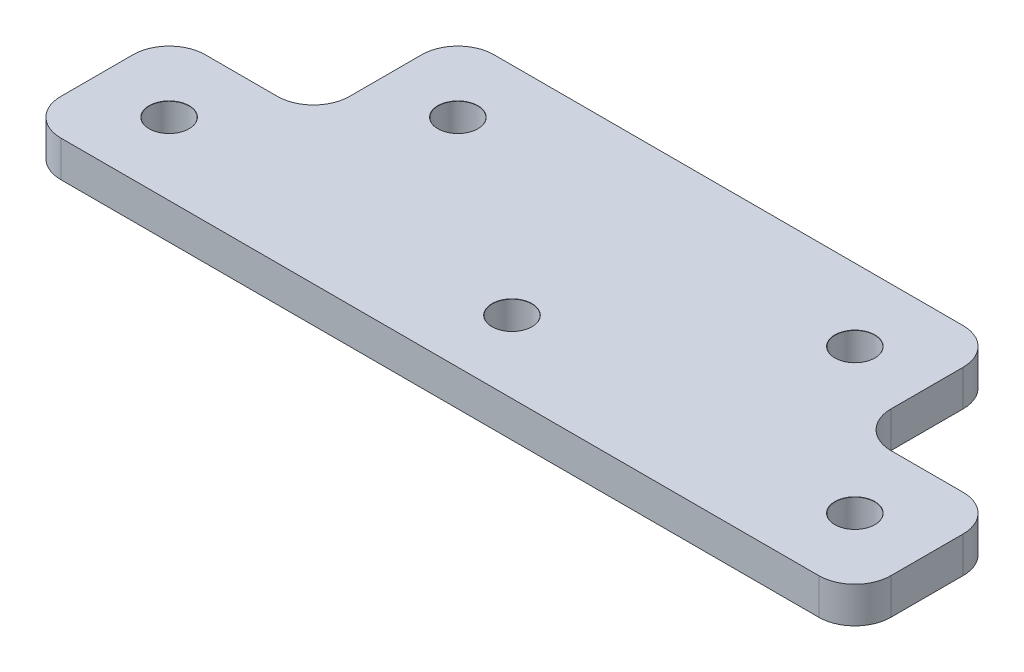
ISO-10303-21;
HEADER;
FILE_DESCRIPTION(('STEP AP214'),'2;1');
FILE_NAME('part.step','',(''),(''),'','','');
FILE_SCHEMA(('AUTOMOTIVE_DESIGN { 1 0 10303 214 1 1 1 1 }'));
ENDSEC;
DATA;
#1=APPLICATION_CONTEXT('core data for automotive mechanical design processes');
#2=APPLICATION_PROTOCOL_DEFINITION('international standard','automotive_design',2000,#1);
#3=PRODUCT_CONTEXT('',#1,'mechanical');
#4=PRODUCT('Part','Part','',(#3));
#5=PRODUCT_RELATED_PRODUCT_CATEGORY('part','',(#4));
#6=PRODUCT_DEFINITION_FORMATION('','',#4);
#7=PRODUCT_DEFINITION_CONTEXT('part definition',#1,'design');
#8=PRODUCT_DEFINITION('design','',#6,#7);
#9=PRODUCT_DEFINITION_SHAPE('','',#8);
#10=(LENGTH_UNIT() NAMED_UNIT(*) SI_UNIT(.MILLI.,.METRE.));
#11=(NAMED_UNIT(*) PLANE_ANGLE_UNIT() SI_UNIT($,.RADIAN.));
#12=(NAMED_UNIT(*) SI_UNIT($,.STERADIAN.) SOLID_ANGLE_UNIT());
#13=UNCERTAINTY_MEASURE_WITH_UNIT(LENGTH_MEASURE(1.E-05),#10,'distance_accuracy_value','');
#14=(GEOMETRIC_REPRESENTATION_CONTEXT(3) GLOBAL_UNCERTAINTY_ASSIGNED_CONTEXT((#13)) GLOBAL_UNIT_ASSIGNED_CONTEXT((#10,
#11,#12)) REPRESENTATION_CONTEXT('',''));
#15=CARTESIAN_POINT('',(0.,0.,0.));
#16=DIRECTION('',(0.,0.,1.));
#17=DIRECTION('',(1.,0.,0.));
#18=AXIS2_PLACEMENT_3D('',#15,#16,#17);
#19=CARTESIAN_POINT('',(37.5,5.,-20.));
#20=DIRECTION('',(-1.,0.,0.));
#21=DIRECTION('',(0.,0.,1.));
#22=AXIS2_PLACEMENT_3D('',#19,#20,#21);
#23=PLANE('',#22);
#24=DIRECTION('',(0.,0.,-1.));
#25=VECTOR('',#24,1.);
#26=CARTESIAN_POINT('',(37.5,5.,-20.));
#27=LINE('',#26,#25);
#28=CARTESIAN_POINT('',(37.5,5.,-25.));
#29=VERTEX_POINT('',#28);
#30=CARTESIAN_POINT('',(37.5,5.,-35.));
#31=VERTEX_POINT('',#30);
#32=EDGE_CURVE('E165',#29,#31,#27,.T.);
#33=ORIENTED_EDGE('',*,*,#32,.F.);
#34=DIRECTION('',(0.,-1.,0.));
#35=VECTOR('',#34,1.);
#36=CARTESIAN_POINT('',(37.5,0.,-25.));
#37=LINE('',#36,#35);
#38=CARTESIAN_POINT('',(37.5,0.,-25.));
#39=VERTEX_POINT('',#38);
#40=EDGE_CURVE('E150',#29,#39,#37,.T.);
#41=ORIENTED_EDGE('',*,*,#40,.T.);
#42=DIRECTION('',(0.,0.,-1.));
#43=VECTOR('',#42,1.);
#44=CARTESIAN_POINT('',(37.5,0.,-20.));
#45=LINE('',#44,#43);
#46=CARTESIAN_POINT('',(37.5,0.,-35.));
#47=VERTEX_POINT('',#46);
#48=EDGE_CURVE('E162',#39,#47,#45,.T.);
#49=ORIENTED_EDGE('',*,*,#48,.T.);
#50=DIRECTION('',(0.,-1.,0.));
#51=VECTOR('',#50,1.);
#52=CARTESIAN_POINT('',(37.5,5.,-35.));
#53=LINE('',#52,#51);
#54=EDGE_CURVE('E167',#47,#31,#53,.F.);
#55=ORIENTED_EDGE('',*,*,#54,.T.);
#56=EDGE_LOOP('',(#33,#41,#49,#55));
#57=FACE_BOUND('',#56,.T.);
#58=ADVANCED_FACE('F32',(#57),#23,.F.);
#59=CARTESIAN_POINT('',(37.5,5.,-40.));
#60=DIRECTION('',(0.,0.,1.));
#61=DIRECTION('',(1.,0.,0.));
#62=AXIS2_PLACEMENT_3D('',#59,#60,#61);
#63=PLANE('',#62);
#64=DIRECTION('',(-1.,0.,0.));
#65=VECTOR('',#64,1.);
#66=CARTESIAN_POINT('',(37.5,0.,-40.));
#67=LINE('',#66,#65);
#68=CARTESIAN_POINT('',(32.5,0.,-40.));
#69=VERTEX_POINT('',#68);
#70=CARTESIAN_POINT('',(-32.5,0.,-40.));
#71=VERTEX_POINT('',#70);
#72=EDGE_CURVE('E173',#69,#71,#67,.T.);
#73=ORIENTED_EDGE('',*,*,#72,.T.);
#74=DIRECTION('',(0.,-1.,0.));
#75=VECTOR('',#74,1.);
#76=CARTESIAN_POINT('',(-32.5,5.,-40.));
#77=LINE('',#76,#75);
#78=CARTESIAN_POINT('',(-32.5,5.,-40.));
#79=VERTEX_POINT('',#78);
#80=EDGE_CURVE('E229',#71,#79,#77,.F.);
#81=ORIENTED_EDGE('',*,*,#80,.T.);
#82=DIRECTION('',(-1.,0.,0.));
#83=VECTOR('',#82,1.);
#84=CARTESIAN_POINT('',(37.5,5.,-40.));
#85=LINE('',#84,#83);
#86=CARTESIAN_POINT('',(32.5,5.,-40.));
#87=VERTEX_POINT('',#86);
#88=EDGE_CURVE('E281',#87,#79,#85,.T.);
#89=ORIENTED_EDGE('',*,*,#88,.F.);
#90=DIRECTION('',(0.,-1.,0.));
#91=VECTOR('',#90,1.);
#92=CARTESIAN_POINT('',(32.5,5.,-40.));
#93=LINE('',#92,#91);
#94=EDGE_CURVE('E226',#87,#69,#93,.T.);
#95=ORIENTED_EDGE('',*,*,#94,.T.);
#96=EDGE_LOOP('',(#73,#81,#89,#95));
#97=FACE_BOUND('',#96,.T.);
#98=ADVANCED_FACE('F323',(#97),#63,.F.);
#99=CARTESIAN_POINT('',(-37.5,5.,-40.));
#100=DIRECTION('',(1.,0.,0.));
#101=DIRECTION('',(0.,0.,-1.));
#102=AXIS2_PLACEMENT_3D('',#99,#100,#101);
#103=PLANE('',#102);
#104=DIRECTION('',(0.,0.,1.));
#105=VECTOR('',#104,1.);
#106=CARTESIAN_POINT('',(-37.5,0.,-40.));
#107=LINE('',#106,#105);
#108=CARTESIAN_POINT('',(-37.5,0.,-35.));
#109=VERTEX_POINT('',#108);
#110=CARTESIAN_POINT('',(-37.5,0.,-25.));
#111=VERTEX_POINT('',#110);
#112=EDGE_CURVE('E177',#109,#111,#107,.T.);
#113=ORIENTED_EDGE('',*,*,#112,.T.);
#114=DIRECTION('',(0.,-1.,0.));
#115=VECTOR('',#114,1.);
#116=CARTESIAN_POINT('',(-37.5,5.,-25.));
#117=LINE('',#116,#115);
#118=CARTESIAN_POINT('',(-37.5,5.,-25.));
#119=VERTEX_POINT('',#118);
#120=EDGE_CURVE('E213',#111,#119,#117,.F.);
#121=ORIENTED_EDGE('',*,*,#120,.T.);
#122=DIRECTION('',(0.,0.,1.));
#123=VECTOR('',#122,1.);
#124=CARTESIAN_POINT('',(-37.5,5.,-40.));
#125=LINE('',#124,#123);
#126=CARTESIAN_POINT('',(-37.5,5.,-35.));
#127=VERTEX_POINT('',#126);
#128=EDGE_CURVE('E272',#127,#119,#125,.T.);
#129=ORIENTED_EDGE('',*,*,#128,.F.);
#130=DIRECTION('',(0.,-1.,0.));
#131=VECTOR('',#130,1.);
#132=CARTESIAN_POINT('',(-37.5,5.,-35.));
#133=LINE('',#132,#131);
#134=EDGE_CURVE('E210',#127,#109,#133,.T.);
#135=ORIENTED_EDGE('',*,*,#134,.T.);
#136=EDGE_LOOP('',(#113,#121,#129,#135));
#137=FACE_BOUND('',#136,.T.);
#138=ADVANCED_FACE('F260',(#137),#103,.F.);
#139=CARTESIAN_POINT('',(-37.5,5.,-20.));
#140=DIRECTION('',(0.,0.,1.));
#141=DIRECTION('',(1.,0.,0.));
#142=AXIS2_PLACEMENT_3D('',#139,#140,#141);
#143=PLANE('',#142);
#144=DIRECTION('',(-1.,0.,0.));
#145=VECTOR('',#144,1.);
#146=CARTESIAN_POINT('',(-37.5,5.,-20.));
#147=LINE('',#146,#145);
#148=CARTESIAN_POINT('',(-42.5,5.,-20.));
#149=VERTEX_POINT('',#148);
#150=CARTESIAN_POINT('',(-52.5,5.,-20.));
#151=VERTEX_POINT('',#150);
#152=EDGE_CURVE('E270',#149,#151,#147,.T.);
#153=ORIENTED_EDGE('',*,*,#152,.F.);
#154=DIRECTION('',(0.,-1.,0.));
#155=VECTOR('',#154,1.);
#156=CARTESIAN_POINT('',(-42.5,0.,-20.));
#157=LINE('',#156,#155);
#158=CARTESIAN_POINT('',(-42.5,0.,-20.));
#159=VERTEX_POINT('',#158);
#160=EDGE_CURVE('E207',#149,#159,#157,.T.);
#161=ORIENTED_EDGE('',*,*,#160,.T.);
#162=DIRECTION('',(-1.,0.,0.));
#163=VECTOR('',#162,1.);
#164=CARTESIAN_POINT('',(-37.5,0.,-20.));
#165=LINE('',#164,#163);
#166=CARTESIAN_POINT('',(-52.5,0.,-20.));
#167=VERTEX_POINT('',#166);
#168=EDGE_CURVE('E188',#159,#167,#165,.T.);
#169=ORIENTED_EDGE('',*,*,#168,.T.);
#170=DIRECTION('',(0.,-1.,0.));
#171=VECTOR('',#170,1.);
#172=CARTESIAN_POINT('',(-52.5,5.,-20.));
#173=LINE('',#172,#171);
#174=EDGE_CURVE('E205',#167,#151,#173,.F.);
#175=ORIENTED_EDGE('',*,*,#174,.T.);
#176=EDGE_LOOP('',(#153,#161,#169,#175));
#177=FACE_BOUND('',#176,.T.);
#178=ADVANCED_FACE('F274',(#177),#143,.F.);
#179=CARTESIAN_POINT('',(-57.5,5.,-20.));
#180=DIRECTION('',(1.,0.,0.));
#181=DIRECTION('',(0.,0.,-1.));
#182=AXIS2_PLACEMENT_3D('',#179,#180,#181);
#183=PLANE('',#182);
#184=DIRECTION('',(0.,0.,1.));
#185=VECTOR('',#184,1.);
#186=CARTESIAN_POINT('',(-57.5,5.,-20.));
#187=LINE('',#186,#185);
#188=CARTESIAN_POINT('',(-57.5,5.,-15.));
#189=VERTEX_POINT('',#188);
#190=CARTESIAN_POINT('',(-57.5,5.,-5.00000000000001));
#191=VERTEX_POINT('',#190);
#192=EDGE_CURVE('E276',#189,#191,#187,.T.);
#193=ORIENTED_EDGE('',*,*,#192,.F.);
#194=DIRECTION('',(0.,-1.,0.));
#195=VECTOR('',#194,1.);
#196=CARTESIAN_POINT('',(-57.5,5.,-15.));
#197=LINE('',#196,#195);
#198=CARTESIAN_POINT('',(-57.5,0.,-15.));
#199=VERTEX_POINT('',#198);
#200=EDGE_CURVE('E157',#189,#199,#197,.T.);
#201=ORIENTED_EDGE('',*,*,#200,.T.);
#202=DIRECTION('',(0.,0.,1.));
#203=VECTOR('',#202,1.);
#204=CARTESIAN_POINT('',(-57.5,0.,-20.));
#205=LINE('',#204,#203);
#206=CARTESIAN_POINT('',(-57.5,0.,-5.00000000000001));
#207=VERTEX_POINT('',#206);
#208=EDGE_CURVE('E191',#199,#207,#205,.T.);
#209=ORIENTED_EDGE('',*,*,#208,.T.);
#210=DIRECTION('',(0.,-1.,0.));
#211=VECTOR('',#210,1.);
#212=CARTESIAN_POINT('',(-57.5,5.,-5.00000000000001));
#213=LINE('',#212,#211);
#214=EDGE_CURVE('E251',#207,#191,#213,.F.);
#215=ORIENTED_EDGE('',*,*,#214,.T.);
#216=EDGE_LOOP('',(#193,#201,#209,#215));
#217=FACE_BOUND('',#216,.T.);
#218=ADVANCED_FACE('F311',(#217),#183,.F.);
#219=CARTESIAN_POINT('',(-57.5,5.,0.));
#220=DIRECTION('',(0.,0.,-1.));
#221=DIRECTION('',(-1.,0.,0.));
#222=AXIS2_PLACEMENT_3D('',#219,#220,#221);
#223=PLANE('',#222);
#224=DIRECTION('',(1.,0.,0.));
#225=VECTOR('',#224,1.);
#226=CARTESIAN_POINT('',(-57.5,0.,0.));
#227=LINE('',#226,#225);
#228=CARTESIAN_POINT('',(-52.5,0.,0.));
#229=VERTEX_POINT('',#228);
#230=CARTESIAN_POINT('',(52.5,0.,0.));
#231=VERTEX_POINT('',#230);
#232=EDGE_CURVE('E194',#229,#231,#227,.T.);
#233=ORIENTED_EDGE('',*,*,#232,.T.);
#234=DIRECTION('',(0.,-1.,0.));
#235=VECTOR('',#234,1.);
#236=CARTESIAN_POINT('',(52.5,5.,0.));
#237=LINE('',#236,#235);
#238=CARTESIAN_POINT('',(52.5,5.,0.));
#239=VERTEX_POINT('',#238);
#240=EDGE_CURVE('E249',#231,#239,#237,.F.);
#241=ORIENTED_EDGE('',*,*,#240,.T.);
#242=DIRECTION('',(1.,0.,0.));
#243=VECTOR('',#242,1.);
#244=CARTESIAN_POINT('',(-57.5,5.,0.));
#245=LINE('',#244,#243);
#246=CARTESIAN_POINT('',(-52.5,5.,0.));
#247=VERTEX_POINT('',#246);
#248=EDGE_CURVE('E279',#247,#239,#245,.T.);
#249=ORIENTED_EDGE('',*,*,#248,.F.);
#250=DIRECTION('',(0.,-1.,0.));
#251=VECTOR('',#250,1.);
#252=CARTESIAN_POINT('',(-52.5,5.,0.));
#253=LINE('',#252,#251);
#254=EDGE_CURVE('E246',#247,#229,#253,.T.);
#255=ORIENTED_EDGE('',*,*,#254,.T.);
#256=EDGE_LOOP('',(#233,#241,#249,#255));
#257=FACE_BOUND('',#256,.T.);
#258=ADVANCED_FACE('F302',(#257),#223,.F.);
#259=CARTESIAN_POINT('',(57.5,5.,0.));
#260=DIRECTION('',(-1.,0.,0.));
#261=DIRECTION('',(0.,0.,1.));
#262=AXIS2_PLACEMENT_3D('',#259,#260,#261);
#263=PLANE('',#262);
#264=DIRECTION('',(0.,0.,-1.));
#265=VECTOR('',#264,1.);
#266=CARTESIAN_POINT('',(57.5,5.,0.));
#267=LINE('',#266,#265);
#268=CARTESIAN_POINT('',(57.5,5.,-5.));
#269=VERTEX_POINT('',#268);
#270=CARTESIAN_POINT('',(57.5,5.,-15.));
#271=VERTEX_POINT('',#270);
#272=EDGE_CURVE('E285',#269,#271,#267,.T.);
#273=ORIENTED_EDGE('',*,*,#272,.F.);
#274=DIRECTION('',(0.,-1.,0.));
#275=VECTOR('',#274,1.);
#276=CARTESIAN_POINT('',(57.5,5.,-5.));
#277=LINE('',#276,#275);
#278=CARTESIAN_POINT('',(57.5,0.,-5.));
#279=VERTEX_POINT('',#278);
#280=EDGE_CURVE('E243',#269,#279,#277,.T.);
#281=ORIENTED_EDGE('',*,*,#280,.T.);
#282=DIRECTION('',(0.,0.,-1.));
#283=VECTOR('',#282,1.);
#284=CARTESIAN_POINT('',(57.5,0.,0.));
#285=LINE('',#284,#283);
#286=CARTESIAN_POINT('',(57.5,0.,-15.));
#287=VERTEX_POINT('',#286);
#288=EDGE_CURVE('E197',#279,#287,#285,.T.);
#289=ORIENTED_EDGE('',*,*,#288,.T.);
#290=DIRECTION('',(0.,-1.,0.));
#291=VECTOR('',#290,1.);
#292=CARTESIAN_POINT('',(57.5,5.,-15.));
#293=LINE('',#292,#291);
#294=EDGE_CURVE('E47',#287,#271,#293,.F.);
#295=ORIENTED_EDGE('',*,*,#294,.T.);
#296=EDGE_LOOP('',(#273,#281,#289,#295));
#297=FACE_BOUND('',#296,.T.);
#298=ADVANCED_FACE('F295',(#297),#263,.F.);
#299=CARTESIAN_POINT('',(57.5,5.,-20.));
#300=DIRECTION('',(0.,0.,1.));
#301=DIRECTION('',(1.,0.,0.));
#302=AXIS2_PLACEMENT_3D('',#299,#300,#301);
#303=PLANE('',#302);
#304=DIRECTION('',(-1.,0.,0.));
#305=VECTOR('',#304,1.);
#306=CARTESIAN_POINT('',(57.5,0.,-20.));
#307=LINE('',#306,#305);
#308=CARTESIAN_POINT('',(52.5,0.,-20.));
#309=VERTEX_POINT('',#308);
#310=CARTESIAN_POINT('',(42.5,0.,-20.));
#311=VERTEX_POINT('',#310);
#312=EDGE_CURVE('E199',#309,#311,#307,.T.);
#313=ORIENTED_EDGE('',*,*,#312,.T.);
#314=DIRECTION('',(0.,-1.,0.));
#315=VECTOR('',#314,1.);
#316=CARTESIAN_POINT('',(42.5,5.,-20.));
#317=LINE('',#316,#315);
#318=CARTESIAN_POINT('',(42.5,5.,-20.));
#319=VERTEX_POINT('',#318);
#320=EDGE_CURVE('E151',#311,#319,#317,.F.);
#321=ORIENTED_EDGE('',*,*,#320,.T.);
#322=DIRECTION('',(-1.,0.,0.));
#323=VECTOR('',#322,1.);
#324=CARTESIAN_POINT('',(57.5,5.,-20.));
#325=LINE('',#324,#323);
#326=CARTESIAN_POINT('',(52.5,5.,-20.));
#327=VERTEX_POINT('',#326);
#328=EDGE_CURVE('E183',#327,#319,#325,.T.);
#329=ORIENTED_EDGE('',*,*,#328,.F.);
#330=DIRECTION('',(0.,-1.,0.));
#331=VECTOR('',#330,1.);
#332=CARTESIAN_POINT('',(52.5,5.,-20.));
#333=LINE('',#332,#331);
#334=EDGE_CURVE('E166',#327,#309,#333,.T.);
#335=ORIENTED_EDGE('',*,*,#334,.T.);
#336=EDGE_LOOP('',(#313,#321,#329,#335));
#337=FACE_BOUND('',#336,.T.);
#338=ADVANCED_FACE('F291',(#337),#303,.F.);
#339=CARTESIAN_POINT('',(0.,5.,0.));
#340=DIRECTION('',(0.,1.,0.));
#341=DIRECTION('',(0.,0.,1.));
#342=AXIS2_PLACEMENT_3D('',#339,#340,#341);
#343=PLANE('',#342);
#344=CARTESIAN_POINT('',(0.,5.,-10.));
#345=DIRECTION('',(0.,1.,0.));
#346=DIRECTION('',(0.,0.,1.));
#347=AXIS2_PLACEMENT_3D('',#344,#345,#346);
#348=CIRCLE('',#347,2.775);
#349=CARTESIAN_POINT('',(0.,5.,-7.225));
#350=VERTEX_POINT('',#349);
#351=EDGE_CURVE('E571',#350,#350,#348,.T.);
#352=ORIENTED_EDGE('',*,*,#351,.F.);
#353=EDGE_LOOP('',(#352));
#354=FACE_BOUND('',#353,.T.);
#355=CARTESIAN_POINT('',(47.5,5.,-10.));
#356=DIRECTION('',(0.,1.,0.));
#357=DIRECTION('',(0.,0.,1.));
#358=AXIS2_PLACEMENT_3D('',#355,#356,#357);
#359=CIRCLE('',#358,2.775);
#360=CARTESIAN_POINT('',(47.5,5.,-7.225));
#361=VERTEX_POINT('',#360);
#362=EDGE_CURVE('E578',#361,#361,#359,.T.);
#363=ORIENTED_EDGE('',*,*,#362,.F.);
#364=EDGE_LOOP('',(#363));
#365=FACE_BOUND('',#364,.T.);
#366=CARTESIAN_POINT('',(-47.5,5.,-10.));
#367=DIRECTION('',(0.,1.,0.));
#368=DIRECTION('',(0.,0.,1.));
#369=AXIS2_PLACEMENT_3D('',#366,#367,#368);
#370=CIRCLE('',#369,2.775);
#371=CARTESIAN_POINT('',(-47.5,5.,-7.225));
#372=VERTEX_POINT('',#371);
#373=EDGE_CURVE('E587',#372,#372,#370,.T.);
#374=ORIENTED_EDGE('',*,*,#373,.F.);
#375=EDGE_LOOP('',(#374));
#376=FACE_BOUND('',#375,.T.);
#377=CARTESIAN_POINT('',(27.5,5.,-30.));
#378=DIRECTION('',(0.,1.,0.));
#379=DIRECTION('',(0.,0.,1.));
#380=AXIS2_PLACEMENT_3D('',#377,#378,#379);
#381=CIRCLE('',#380,2.775);
#382=CARTESIAN_POINT('',(27.5,5.,-27.225));
#383=VERTEX_POINT('',#382);
#384=EDGE_CURVE('E596',#383,#383,#381,.T.);
#385=ORIENTED_EDGE('',*,*,#384,.F.);
#386=EDGE_LOOP('',(#385));
#387=FACE_BOUND('',#386,.T.);
#388=CARTESIAN_POINT('',(-27.5,5.,-30.));
#389=DIRECTION('',(0.,1.,0.));
#390=DIRECTION('',(0.,0.,1.));
#391=AXIS2_PLACEMENT_3D('',#388,#389,#390);
#392=CIRCLE('',#391,2.775);
#393=CARTESIAN_POINT('',(-27.5,5.,-27.225));
#394=VERTEX_POINT('',#393);
#395=EDGE_CURVE('E605',#394,#394,#392,.T.);
#396=ORIENTED_EDGE('',*,*,#395,.F.);
#397=EDGE_LOOP('',(#396));
#398=FACE_BOUND('',#397,.T.);
#399=ORIENTED_EDGE('',*,*,#88,.T.);
#400=CARTESIAN_POINT('',(-32.5,5.,-35.));
#401=DIRECTION('',(0.,1.,0.));
#402=DIRECTION('',(0.,0.,1.));
#403=AXIS2_PLACEMENT_3D('',#400,#401,#402);
#404=CIRCLE('',#403,5.);
#405=EDGE_CURVE('E240',#79,#127,#404,.T.);
#406=ORIENTED_EDGE('',*,*,#405,.T.);
#407=ORIENTED_EDGE('',*,*,#128,.T.);
#408=CARTESIAN_POINT('',(-42.5,5.,-25.));
#409=DIRECTION('',(0.,1.,0.));
#410=DIRECTION('',(0.,0.,1.));
#411=AXIS2_PLACEMENT_3D('',#408,#409,#410);
#412=CIRCLE('',#411,5.);
#413=EDGE_CURVE('E11',#119,#149,#412,.F.);
#414=ORIENTED_EDGE('',*,*,#413,.T.);
#415=ORIENTED_EDGE('',*,*,#152,.T.);
#416=CARTESIAN_POINT('',(-52.5,5.,-15.));
#417=DIRECTION('',(0.,1.,0.));
#418=DIRECTION('',(0.,0.,1.));
#419=AXIS2_PLACEMENT_3D('',#416,#417,#418);
#420=CIRCLE('',#419,5.);
#421=EDGE_CURVE('E233',#151,#189,#420,.T.);
#422=ORIENTED_EDGE('',*,*,#421,.T.);
#423=ORIENTED_EDGE('',*,*,#192,.T.);
#424=CARTESIAN_POINT('',(-52.5,5.,-5.));
#425=DIRECTION('',(0.,1.,0.));
#426=DIRECTION('',(0.,0.,1.));
#427=AXIS2_PLACEMENT_3D('',#424,#425,#426);
#428=CIRCLE('',#427,5.);
#429=EDGE_CURVE('E231',#191,#247,#428,.T.);
#430=ORIENTED_EDGE('',*,*,#429,.T.);
#431=ORIENTED_EDGE('',*,*,#248,.T.);
#432=CARTESIAN_POINT('',(52.5,5.,-5.));
#433=DIRECTION('',(0.,1.,0.));
#434=DIRECTION('',(0.,0.,1.));
#435=AXIS2_PLACEMENT_3D('',#432,#433,#434);
#436=CIRCLE('',#435,5.);
#437=EDGE_CURVE('E54',#239,#269,#436,.T.);
#438=ORIENTED_EDGE('',*,*,#437,.T.);
#439=ORIENTED_EDGE('',*,*,#272,.T.);
#440=CARTESIAN_POINT('',(52.5,5.,-15.));
#441=DIRECTION('',(0.,1.,0.));
#442=DIRECTION('',(0.,0.,1.));
#443=AXIS2_PLACEMENT_3D('',#440,#441,#442);
#444=CIRCLE('',#443,5.);
#445=EDGE_CURVE('E235',#271,#327,#444,.T.);
#446=ORIENTED_EDGE('',*,*,#445,.T.);
#447=ORIENTED_EDGE('',*,*,#328,.T.);
#448=CARTESIAN_POINT('',(42.5,5.,-25.));
#449=DIRECTION('',(0.,1.,0.));
#450=DIRECTION('',(0.,0.,1.));
#451=AXIS2_PLACEMENT_3D('',#448,#449,#450);
#452=CIRCLE('',#451,5.);
#453=EDGE_CURVE('E156',#319,#29,#452,.F.);
#454=ORIENTED_EDGE('',*,*,#453,.T.);
#455=ORIENTED_EDGE('',*,*,#32,.T.);
#456=CARTESIAN_POINT('',(32.5,5.,-35.));
#457=DIRECTION('',(0.,1.,0.));
#458=DIRECTION('',(0.,0.,1.));
#459=AXIS2_PLACEMENT_3D('',#456,#457,#458);
#460=CIRCLE('',#459,5.);
#461=EDGE_CURVE('E238',#31,#87,#460,.T.);
#462=ORIENTED_EDGE('',*,*,#461,.T.);
#463=EDGE_LOOP('',(#399,#406,#407,#414,#415,#422,#423,#430,#431,#438,#439,#446,#447,#454,#455,#462));
#464=FACE_BOUND('',#463,.T.);
#465=ADVANCED_FACE('F269',(#354,#365,#376,#387,#398,#464),#343,.T.);
#466=CARTESIAN_POINT('',(0.,0.,0.));
#467=DIRECTION('',(0.,1.,0.));
#468=DIRECTION('',(0.,0.,1.));
#469=AXIS2_PLACEMENT_3D('',#466,#467,#468);
#470=PLANE('',#469);
#471=CARTESIAN_POINT('',(0.,0.,-10.));
#472=DIRECTION('',(0.,1.,0.));
#473=DIRECTION('',(0.,0.,1.));
#474=AXIS2_PLACEMENT_3D('',#471,#472,#473);
#475=CIRCLE('',#474,2.75);
#476=CARTESIAN_POINT('',(0.,0.,-7.25));
#477=VERTEX_POINT('',#476);
#478=EDGE_CURVE('E573',#477,#477,#475,.T.);
#479=ORIENTED_EDGE('',*,*,#478,.T.);
#480=EDGE_LOOP('',(#479));
#481=FACE_BOUND('',#480,.T.);
#482=CARTESIAN_POINT('',(47.5,0.,-10.));
#483=DIRECTION('',(0.,1.,0.));
#484=DIRECTION('',(0.,0.,1.));
#485=AXIS2_PLACEMENT_3D('',#482,#483,#484);
#486=CIRCLE('',#485,2.75);
#487=CARTESIAN_POINT('',(47.5,0.,-7.25));
#488=VERTEX_POINT('',#487);
#489=EDGE_CURVE('E584',#488,#488,#486,.T.);
#490=ORIENTED_EDGE('',*,*,#489,.T.);
#491=EDGE_LOOP('',(#490));
#492=FACE_BOUND('',#491,.T.);
#493=CARTESIAN_POINT('',(-47.5,0.,-10.));
#494=DIRECTION('',(0.,1.,0.));
#495=DIRECTION('',(0.,0.,1.));
#496=AXIS2_PLACEMENT_3D('',#493,#494,#495);
#497=CIRCLE('',#496,2.75);
#498=CARTESIAN_POINT('',(-47.5,0.,-7.25));
#499=VERTEX_POINT('',#498);
#500=EDGE_CURVE('E593',#499,#499,#497,.T.);
#501=ORIENTED_EDGE('',*,*,#500,.T.);
#502=EDGE_LOOP('',(#501));
#503=FACE_BOUND('',#502,.T.);
#504=CARTESIAN_POINT('',(27.5,0.,-30.));
#505=DIRECTION('',(0.,1.,0.));
#506=DIRECTION('',(0.,0.,1.));
#507=AXIS2_PLACEMENT_3D('',#504,#505,#506);
#508=CIRCLE('',#507,2.75);
#509=CARTESIAN_POINT('',(27.5,0.,-27.25));
#510=VERTEX_POINT('',#509);
#511=EDGE_CURVE('E602',#510,#510,#508,.T.);
#512=ORIENTED_EDGE('',*,*,#511,.T.);
#513=EDGE_LOOP('',(#512));
#514=FACE_BOUND('',#513,.T.);
#515=CARTESIAN_POINT('',(-27.5,0.,-30.));
#516=DIRECTION('',(0.,1.,0.));
#517=DIRECTION('',(0.,0.,1.));
#518=AXIS2_PLACEMENT_3D('',#515,#516,#517);
#519=CIRCLE('',#518,2.75);
#520=CARTESIAN_POINT('',(-27.5,0.,-27.25));
#521=VERTEX_POINT('',#520);
#522=EDGE_CURVE('E174',#521,#521,#519,.T.);
#523=ORIENTED_EDGE('',*,*,#522,.T.);
#524=EDGE_LOOP('',(#523));
#525=FACE_BOUND('',#524,.T.);
#526=ORIENTED_EDGE('',*,*,#112,.F.);
#527=CARTESIAN_POINT('',(-32.5,0.,-35.));
#528=DIRECTION('',(0.,1.,0.));
#529=DIRECTION('',(0.,0.,1.));
#530=AXIS2_PLACEMENT_3D('',#527,#528,#529);
#531=CIRCLE('',#530,5.);
#532=EDGE_CURVE('E224',#109,#71,#531,.F.);
#533=ORIENTED_EDGE('',*,*,#532,.T.);
#534=ORIENTED_EDGE('',*,*,#72,.F.);
#535=CARTESIAN_POINT('',(32.5,0.,-35.));
#536=DIRECTION('',(0.,1.,0.));
#537=DIRECTION('',(0.,0.,1.));
#538=AXIS2_PLACEMENT_3D('',#535,#536,#537);
#539=CIRCLE('',#538,5.);
#540=EDGE_CURVE('E172',#69,#47,#539,.F.);
#541=ORIENTED_EDGE('',*,*,#540,.T.);
#542=ORIENTED_EDGE('',*,*,#48,.F.);
#543=CARTESIAN_POINT('',(42.5,0.,-25.));
#544=DIRECTION('',(0.,1.,0.));
#545=DIRECTION('',(0.,0.,1.));
#546=AXIS2_PLACEMENT_3D('',#543,#544,#545);
#547=CIRCLE('',#546,5.);
#548=EDGE_CURVE('E146',#39,#311,#547,.T.);
#549=ORIENTED_EDGE('',*,*,#548,.T.);
#550=ORIENTED_EDGE('',*,*,#312,.F.);
#551=CARTESIAN_POINT('',(52.5,0.,-15.));
#552=DIRECTION('',(0.,1.,0.));
#553=DIRECTION('',(0.,0.,1.));
#554=AXIS2_PLACEMENT_3D('',#551,#552,#553);
#555=CIRCLE('',#554,5.);
#556=EDGE_CURVE('E219',#309,#287,#555,.F.);
#557=ORIENTED_EDGE('',*,*,#556,.T.);
#558=ORIENTED_EDGE('',*,*,#288,.F.);
#559=CARTESIAN_POINT('',(52.5,0.,-5.));
#560=DIRECTION('',(0.,1.,0.));
#561=DIRECTION('',(0.,0.,1.));
#562=AXIS2_PLACEMENT_3D('',#559,#560,#561);
#563=CIRCLE('',#562,5.);
#564=EDGE_CURVE('E221',#279,#231,#563,.F.);
#565=ORIENTED_EDGE('',*,*,#564,.T.);
#566=ORIENTED_EDGE('',*,*,#232,.F.);
#567=CARTESIAN_POINT('',(-52.5,0.,-5.));
#568=DIRECTION('',(0.,1.,0.));
#569=DIRECTION('',(0.,0.,1.));
#570=AXIS2_PLACEMENT_3D('',#567,#568,#569);
#571=CIRCLE('',#570,5.);
#572=EDGE_CURVE('E215',#229,#207,#571,.F.);
#573=ORIENTED_EDGE('',*,*,#572,.T.);
#574=ORIENTED_EDGE('',*,*,#208,.F.);
#575=CARTESIAN_POINT('',(-52.5,0.,-15.));
#576=DIRECTION('',(0.,1.,0.));
#577=DIRECTION('',(0.,0.,1.));
#578=AXIS2_PLACEMENT_3D('',#575,#576,#577);
#579=CIRCLE('',#578,5.);
#580=EDGE_CURVE('E217',#199,#167,#579,.F.);
#581=ORIENTED_EDGE('',*,*,#580,.T.);
#582=ORIENTED_EDGE('',*,*,#168,.F.);
#583=CARTESIAN_POINT('',(-42.5,0.,-25.));
#584=DIRECTION('',(0.,1.,0.));
#585=DIRECTION('',(0.,0.,1.));
#586=AXIS2_PLACEMENT_3D('',#583,#584,#585);
#587=CIRCLE('',#586,5.);
#588=EDGE_CURVE('E40',#159,#111,#587,.T.);
#589=ORIENTED_EDGE('',*,*,#588,.T.);
#590=EDGE_LOOP('',(#526,#533,#534,#541,#542,#549,#550,#557,#558,#565,#566,#573,#574,#581,#582,#589));
#591=FACE_BOUND('',#590,.T.);
#592=ADVANCED_FACE('F170',(#481,#492,#503,#514,#525,#591),#470,.F.);
#593=CARTESIAN_POINT('',(42.5,5.,-25.));
#594=DIRECTION('',(0.,1.,0.));
#595=DIRECTION('',(0.,0.,1.));
#596=AXIS2_PLACEMENT_3D('',#593,#594,#595);
#597=CYLINDRICAL_SURFACE('',#596,5.);
#598=ORIENTED_EDGE('',*,*,#453,.F.);
#599=ORIENTED_EDGE('',*,*,#320,.F.);
#600=ORIENTED_EDGE('',*,*,#548,.F.);
#601=ORIENTED_EDGE('',*,*,#40,.F.);
#602=EDGE_LOOP('',(#598,#599,#600,#601));
#603=FACE_BOUND('',#602,.T.);
#604=ADVANCED_FACE('F149',(#603),#597,.F.);
#605=CARTESIAN_POINT('',(-42.5,5.,-25.));
#606=DIRECTION('',(0.,1.,0.));
#607=DIRECTION('',(0.,0.,1.));
#608=AXIS2_PLACEMENT_3D('',#605,#606,#607);
#609=CYLINDRICAL_SURFACE('',#608,5.);
#610=ORIENTED_EDGE('',*,*,#413,.F.);
#611=ORIENTED_EDGE('',*,*,#120,.F.);
#612=ORIENTED_EDGE('',*,*,#588,.F.);
#613=ORIENTED_EDGE('',*,*,#160,.F.);
#614=EDGE_LOOP('',(#610,#611,#612,#613));
#615=FACE_BOUND('',#614,.T.);
#616=ADVANCED_FACE('F265',(#615),#609,.F.);
#617=CARTESIAN_POINT('',(-32.5,5.,-35.));
#618=DIRECTION('',(0.,-1.,0.));
#619=DIRECTION('',(0.,0.,-1.));
#620=AXIS2_PLACEMENT_3D('',#617,#618,#619);
#621=CYLINDRICAL_SURFACE('',#620,5.);
#622=ORIENTED_EDGE('',*,*,#405,.F.);
#623=ORIENTED_EDGE('',*,*,#80,.F.);
#624=ORIENTED_EDGE('',*,*,#532,.F.);
#625=ORIENTED_EDGE('',*,*,#134,.F.);
#626=EDGE_LOOP('',(#622,#623,#624,#625));
#627=FACE_BOUND('',#626,.T.);
#628=ADVANCED_FACE('F336',(#627),#621,.T.);
#629=CARTESIAN_POINT('',(32.5,5.,-35.));
#630=DIRECTION('',(0.,-1.,0.));
#631=DIRECTION('',(0.,0.,-1.));
#632=AXIS2_PLACEMENT_3D('',#629,#630,#631);
#633=CYLINDRICAL_SURFACE('',#632,5.);
#634=ORIENTED_EDGE('',*,*,#461,.F.);
#635=ORIENTED_EDGE('',*,*,#54,.F.);
#636=ORIENTED_EDGE('',*,*,#540,.F.);
#637=ORIENTED_EDGE('',*,*,#94,.F.);
#638=EDGE_LOOP('',(#634,#635,#636,#637));
#639=FACE_BOUND('',#638,.T.);
#640=ADVANCED_FACE('F339',(#639),#633,.T.);
#641=CARTESIAN_POINT('',(52.5,5.,-5.));
#642=DIRECTION('',(0.,-1.,0.));
#643=DIRECTION('',(0.,0.,-1.));
#644=AXIS2_PLACEMENT_3D('',#641,#642,#643);
#645=CYLINDRICAL_SURFACE('',#644,5.);
#646=ORIENTED_EDGE('',*,*,#437,.F.);
#647=ORIENTED_EDGE('',*,*,#240,.F.);
#648=ORIENTED_EDGE('',*,*,#564,.F.);
#649=ORIENTED_EDGE('',*,*,#280,.F.);
#650=EDGE_LOOP('',(#646,#647,#648,#649));
#651=FACE_BOUND('',#650,.T.);
#652=ADVANCED_FACE('F298',(#651),#645,.T.);
#653=CARTESIAN_POINT('',(52.5,5.,-15.));
#654=DIRECTION('',(0.,-1.,0.));
#655=DIRECTION('',(0.,0.,-1.));
#656=AXIS2_PLACEMENT_3D('',#653,#654,#655);
#657=CYLINDRICAL_SURFACE('',#656,5.);
#658=ORIENTED_EDGE('',*,*,#445,.F.);
#659=ORIENTED_EDGE('',*,*,#294,.F.);
#660=ORIENTED_EDGE('',*,*,#556,.F.);
#661=ORIENTED_EDGE('',*,*,#334,.F.);
#662=EDGE_LOOP('',(#658,#659,#660,#661));
#663=FACE_BOUND('',#662,.T.);
#664=ADVANCED_FACE('F293',(#663),#657,.T.);
#665=CARTESIAN_POINT('',(-52.5,5.,-15.));
#666=DIRECTION('',(0.,-1.,0.));
#667=DIRECTION('',(0.,0.,-1.));
#668=AXIS2_PLACEMENT_3D('',#665,#666,#667);
#669=CYLINDRICAL_SURFACE('',#668,5.);
#670=ORIENTED_EDGE('',*,*,#421,.F.);
#671=ORIENTED_EDGE('',*,*,#174,.F.);
#672=ORIENTED_EDGE('',*,*,#580,.F.);
#673=ORIENTED_EDGE('',*,*,#200,.F.);
#674=EDGE_LOOP('',(#670,#671,#672,#673));
#675=FACE_BOUND('',#674,.T.);
#676=ADVANCED_FACE('F314',(#675),#669,.T.);
#677=CARTESIAN_POINT('',(-52.5,5.,-5.));
#678=DIRECTION('',(0.,-1.,0.));
#679=DIRECTION('',(0.,0.,-1.));
#680=AXIS2_PLACEMENT_3D('',#677,#678,#679);
#681=CYLINDRICAL_SURFACE('',#680,5.);
#682=ORIENTED_EDGE('',*,*,#429,.F.);
#683=ORIENTED_EDGE('',*,*,#214,.F.);
#684=ORIENTED_EDGE('',*,*,#572,.F.);
#685=ORIENTED_EDGE('',*,*,#254,.F.);
#686=EDGE_LOOP('',(#682,#683,#684,#685));
#687=FACE_BOUND('',#686,.T.);
#688=ADVANCED_FACE('F34',(#687),#681,.T.);
#689=CARTESIAN_POINT('',(-27.5,5.,-30.));
#690=DIRECTION('',(0.,1.,0.));
#691=DIRECTION('',(0.,0.,1.));
#692=AXIS2_PLACEMENT_3D('',#689,#690,#691);
#693=CYLINDRICAL_SURFACE('',#692,2.75);
#694=ORIENTED_EDGE('',*,*,#522,.F.);
#695=EDGE_LOOP('',(#694));
#696=FACE_BOUND('',#695,.T.);
#697=CARTESIAN_POINT('',(-27.5,4.975,-30.));
#698=DIRECTION('',(0.,1.,0.));
#699=DIRECTION('',(0.,0.,1.));
#700=AXIS2_PLACEMENT_3D('',#697,#698,#699);
#701=CIRCLE('',#700,2.75);
#702=CARTESIAN_POINT('',(-27.5,4.975,-27.25));
#703=VERTEX_POINT('',#702);
#704=EDGE_CURVE('E180',#703,#703,#701,.T.);
#705=ORIENTED_EDGE('',*,*,#704,.T.);
#706=EDGE_LOOP('',(#705));
#707=FACE_BOUND('',#706,.T.);
#708=ADVANCED_FACE('F320',(#696,#707),#693,.F.);
#709=CARTESIAN_POINT('',(-27.5,5.,-30.));
#710=DIRECTION('',(0.,1.,0.));
#711=DIRECTION('',(0.,0.,1.));
#712=AXIS2_PLACEMENT_3D('',#709,#710,#711);
#713=CONICAL_SURFACE('',#712,2.775,0.785398163397431);
#714=ORIENTED_EDGE('',*,*,#704,.F.);
#715=EDGE_LOOP('',(#714));
#716=FACE_BOUND('',#715,.T.);
#717=ORIENTED_EDGE('',*,*,#395,.T.);
#718=EDGE_LOOP('',(#717));
#719=FACE_BOUND('',#718,.T.);
#720=ADVANCED_FACE('F372',(#716,#719),#713,.F.);
#721=CARTESIAN_POINT('',(27.5,5.,-30.));
#722=DIRECTION('',(0.,1.,0.));
#723=DIRECTION('',(0.,0.,1.));
#724=AXIS2_PLACEMENT_3D('',#721,#722,#723);
#725=CYLINDRICAL_SURFACE('',#724,2.75);
#726=ORIENTED_EDGE('',*,*,#511,.F.);
#727=EDGE_LOOP('',(#726));
#728=FACE_BOUND('',#727,.T.);
#729=CARTESIAN_POINT('',(27.5,4.975,-30.));
#730=DIRECTION('',(0.,1.,0.));
#731=DIRECTION('',(0.,0.,1.));
#732=AXIS2_PLACEMENT_3D('',#729,#730,#731);
#733=CIRCLE('',#732,2.75);
#734=CARTESIAN_POINT('',(27.5,4.975,-27.25));
#735=VERTEX_POINT('',#734);
#736=EDGE_CURVE('E599',#735,#735,#733,.T.);
#737=ORIENTED_EDGE('',*,*,#736,.T.);
#738=EDGE_LOOP('',(#737));
#739=FACE_BOUND('',#738,.T.);
#740=ADVANCED_FACE('F382',(#728,#739),#725,.F.);
#741=CARTESIAN_POINT('',(27.5,5.,-30.));
#742=DIRECTION('',(0.,1.,0.));
#743=DIRECTION('',(0.,0.,1.));
#744=AXIS2_PLACEMENT_3D('',#741,#742,#743);
#745=CONICAL_SURFACE('',#744,2.775,0.785398163397431);
#746=ORIENTED_EDGE('',*,*,#736,.F.);
#747=EDGE_LOOP('',(#746));
#748=FACE_BOUND('',#747,.T.);
#749=ORIENTED_EDGE('',*,*,#384,.T.);
#750=EDGE_LOOP('',(#749));
#751=FACE_BOUND('',#750,.T.);
#752=ADVANCED_FACE('F392',(#748,#751),#745,.F.);
#753=CARTESIAN_POINT('',(-47.5,5.,-10.));
#754=DIRECTION('',(0.,1.,0.));
#755=DIRECTION('',(0.,0.,1.));
#756=AXIS2_PLACEMENT_3D('',#753,#754,#755);
#757=CYLINDRICAL_SURFACE('',#756,2.74999999999999);
#758=ORIENTED_EDGE('',*,*,#500,.F.);
#759=EDGE_LOOP('',(#758));
#760=FACE_BOUND('',#759,.T.);
#761=CARTESIAN_POINT('',(-47.5,4.975,-10.));
#762=DIRECTION('',(0.,1.,0.));
#763=DIRECTION('',(0.,0.,1.));
#764=AXIS2_PLACEMENT_3D('',#761,#762,#763);
#765=CIRCLE('',#764,2.74999999999999);
#766=CARTESIAN_POINT('',(-47.5,4.975,-7.25000000000001));
#767=VERTEX_POINT('',#766);
#768=EDGE_CURVE('E590',#767,#767,#765,.T.);
#769=ORIENTED_EDGE('',*,*,#768,.T.);
#770=EDGE_LOOP('',(#769));
#771=FACE_BOUND('',#770,.T.);
#772=ADVANCED_FACE('F402',(#760,#771),#757,.F.);
#773=CARTESIAN_POINT('',(-47.5,5.,-10.));
#774=DIRECTION('',(0.,1.,0.));
#775=DIRECTION('',(0.,0.,1.));
#776=AXIS2_PLACEMENT_3D('',#773,#774,#775);
#777=CONICAL_SURFACE('',#776,2.775,0.785398163397691);
#778=ORIENTED_EDGE('',*,*,#768,.F.);
#779=EDGE_LOOP('',(#778));
#780=FACE_BOUND('',#779,.T.);
#781=ORIENTED_EDGE('',*,*,#373,.T.);
#782=EDGE_LOOP('',(#781));
#783=FACE_BOUND('',#782,.T.);
#784=ADVANCED_FACE('F412',(#780,#783),#777,.F.);
#785=CARTESIAN_POINT('',(47.5,5.,-10.));
#786=DIRECTION('',(0.,1.,0.));
#787=DIRECTION('',(0.,0.,1.));
#788=AXIS2_PLACEMENT_3D('',#785,#786,#787);
#789=CYLINDRICAL_SURFACE('',#788,2.74999999999999);
#790=ORIENTED_EDGE('',*,*,#489,.F.);
#791=EDGE_LOOP('',(#790));
#792=FACE_BOUND('',#791,.T.);
#793=CARTESIAN_POINT('',(47.5,4.975,-10.));
#794=DIRECTION('',(0.,1.,0.));
#795=DIRECTION('',(0.,0.,1.));
#796=AXIS2_PLACEMENT_3D('',#793,#794,#795);
#797=CIRCLE('',#796,2.74999999999999);
#798=CARTESIAN_POINT('',(47.5,4.975,-7.25000000000001));
#799=VERTEX_POINT('',#798);
#800=EDGE_CURVE('E581',#799,#799,#797,.T.);
#801=ORIENTED_EDGE('',*,*,#800,.T.);
#802=EDGE_LOOP('',(#801));
#803=FACE_BOUND('',#802,.T.);
#804=ADVANCED_FACE('F422',(#792,#803),#789,.F.);
#805=CARTESIAN_POINT('',(47.5,5.,-10.));
#806=DIRECTION('',(0.,1.,0.));
#807=DIRECTION('',(0.,0.,1.));
#808=AXIS2_PLACEMENT_3D('',#805,#806,#807);
#809=CONICAL_SURFACE('',#808,2.775,0.785398163397691);
#810=ORIENTED_EDGE('',*,*,#800,.F.);
#811=EDGE_LOOP('',(#810));
#812=FACE_BOUND('',#811,.T.);
#813=ORIENTED_EDGE('',*,*,#362,.T.);
#814=EDGE_LOOP('',(#813));
#815=FACE_BOUND('',#814,.T.);
#816=ADVANCED_FACE('F432',(#812,#815),#809,.F.);
#817=CARTESIAN_POINT('',(0.,5.,-10.));
#818=DIRECTION('',(0.,1.,0.));
#819=DIRECTION('',(0.,0.,1.));
#820=AXIS2_PLACEMENT_3D('',#817,#818,#819);
#821=CYLINDRICAL_SURFACE('',#820,2.74999999999999);
#822=ORIENTED_EDGE('',*,*,#478,.F.);
#823=EDGE_LOOP('',(#822));
#824=FACE_BOUND('',#823,.T.);
#825=CARTESIAN_POINT('',(0.,4.975,-10.));
#826=DIRECTION('',(0.,1.,0.));
#827=DIRECTION('',(0.,0.,1.));
#828=AXIS2_PLACEMENT_3D('',#825,#826,#827);
#829=CIRCLE('',#828,2.74999999999999);
#830=CARTESIAN_POINT('',(0.,4.975,-7.25000000000001));
#831=VERTEX_POINT('',#830);
#832=EDGE_CURVE('E568',#831,#831,#829,.T.);
#833=ORIENTED_EDGE('',*,*,#832,.T.);
#834=EDGE_LOOP('',(#833));
#835=FACE_BOUND('',#834,.T.);
#836=ADVANCED_FACE('F442',(#824,#835),#821,.F.);
#837=CARTESIAN_POINT('',(0.,5.,-10.));
#838=DIRECTION('',(0.,1.,0.));
#839=DIRECTION('',(0.,0.,1.));
#840=AXIS2_PLACEMENT_3D('',#837,#838,#839);
#841=CONICAL_SURFACE('',#840,2.775,0.785398163397691);
#842=ORIENTED_EDGE('',*,*,#832,.F.);
#843=EDGE_LOOP('',(#842));
#844=FACE_BOUND('',#843,.T.);
#845=ORIENTED_EDGE('',*,*,#351,.T.);
#846=EDGE_LOOP('',(#845));
#847=FACE_BOUND('',#846,.T.);
#848=ADVANCED_FACE('F473',(#844,#847),#841,.F.);
#849=CLOSED_SHELL('',(#58,#98,#138,#178,#218,#258,#298,#338,#465,#592,#604,#616,#628,#640,#652,
#664,#676,#688,#708,#720,#740,#752,#772,#784,#804,#816,#836,#848));
#850=MANIFOLD_SOLID_BREP('B2',#849);
#851=ADVANCED_BREP_SHAPE_REPRESENTATION('',(#18,#850),#14);
#852=SHAPE_DEFINITION_REPRESENTATION(#9,#851);
ENDSEC;
END-ISO-10303-21;
